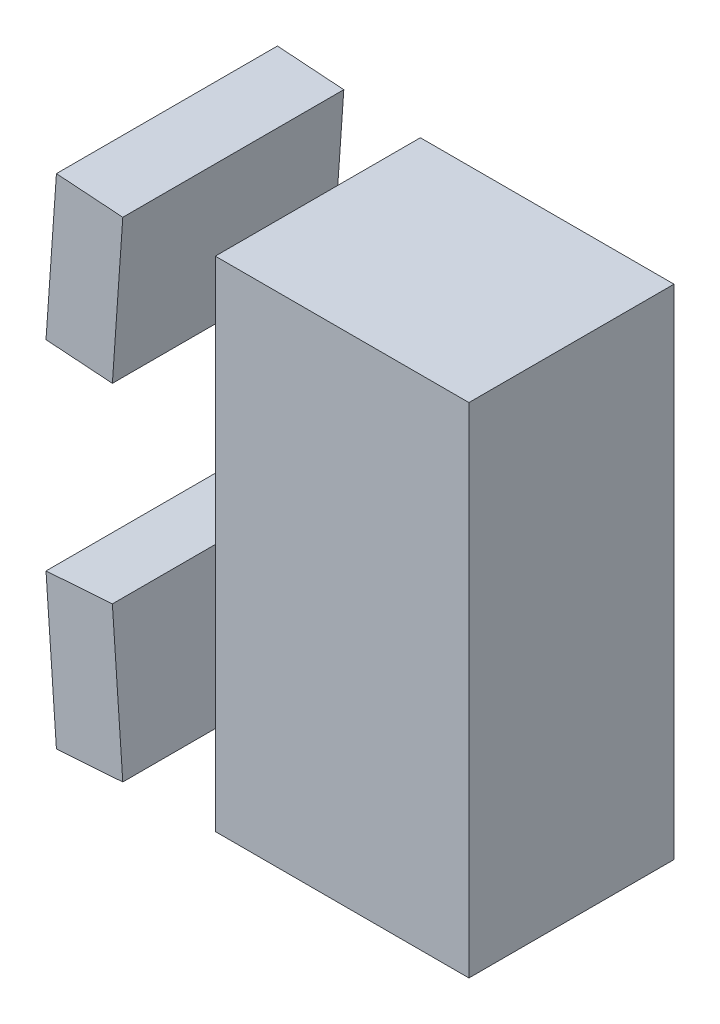
ISO-10303-21;
HEADER;
FILE_DESCRIPTION(('STEP AP214'),'2;1');
FILE_NAME('part.step','',(''),(''),'','','');
FILE_SCHEMA(('AUTOMOTIVE_DESIGN { 1 0 10303 214 1 1 1 1 }'));
ENDSEC;
DATA;
#1=APPLICATION_CONTEXT('core data for automotive mechanical design processes');
#2=APPLICATION_PROTOCOL_DEFINITION('international standard','automotive_design',2000,#1);
#3=PRODUCT_CONTEXT('',#1,'mechanical');
#4=PRODUCT('Part','Part','',(#3));
#5=PRODUCT_RELATED_PRODUCT_CATEGORY('part','',(#4));
#6=PRODUCT_DEFINITION_FORMATION('','',#4);
#7=PRODUCT_DEFINITION_CONTEXT('part definition',#1,'design');
#8=PRODUCT_DEFINITION('design','',#6,#7);
#9=PRODUCT_DEFINITION_SHAPE('','',#8);
#10=(LENGTH_UNIT() NAMED_UNIT(*) SI_UNIT(.MILLI.,.METRE.));
#11=(NAMED_UNIT(*) PLANE_ANGLE_UNIT() SI_UNIT($,.RADIAN.));
#12=(NAMED_UNIT(*) SI_UNIT($,.STERADIAN.) SOLID_ANGLE_UNIT());
#13=UNCERTAINTY_MEASURE_WITH_UNIT(LENGTH_MEASURE(1.E-05),#10,'distance_accuracy_value','');
#14=(GEOMETRIC_REPRESENTATION_CONTEXT(3) GLOBAL_UNCERTAINTY_ASSIGNED_CONTEXT((#13)) GLOBAL_UNIT_ASSIGNED_CONTEXT((#10,
#11,#12)) REPRESENTATION_CONTEXT('',''));
#15=CARTESIAN_POINT('',(0.,0.,0.));
#16=DIRECTION('',(0.,0.,1.));
#17=DIRECTION('',(1.,0.,0.));
#18=AXIS2_PLACEMENT_3D('',#15,#16,#17);
#19=CARTESIAN_POINT('',(18.2186626156835,26.9694448109971,20.6230863634355));
#20=DIRECTION('',(1.,0.,0.));
#21=DIRECTION('',(0.,0.,-1.));
#22=AXIS2_PLACEMENT_3D('',#19,#20,#21);
#23=PLANE('',#22);
#24=DIRECTION('',(0.,-1.,0.));
#25=VECTOR('',#24,1.);
#26=CARTESIAN_POINT('',(18.2186626156835,26.9694448109971,-1.57308636343545));
#27=LINE('',#26,#25);
#28=CARTESIAN_POINT('',(18.2186626156835,26.9694448109971,-1.57308636343545));
#29=VERTEX_POINT('',#28);
#30=CARTESIAN_POINT('',(18.2186626156835,-26.9694448109971,-1.57308636343545));
#31=VERTEX_POINT('',#30);
#32=EDGE_CURVE('E104',#29,#31,#27,.T.);
#33=ORIENTED_EDGE('',*,*,#32,.T.);
#34=DIRECTION('',(0.,0.,1.));
#35=VECTOR('',#34,1.);
#36=CARTESIAN_POINT('',(18.2186626156835,-26.9694448109971,20.6230863634355));
#37=LINE('',#36,#35);
#38=CARTESIAN_POINT('',(18.2186626156835,-26.9694448109971,20.6230863634355));
#39=VERTEX_POINT('',#38);
#40=EDGE_CURVE('E99',#31,#39,#37,.T.);
#41=ORIENTED_EDGE('',*,*,#40,.T.);
#42=DIRECTION('',(0.,-1.,0.));
#43=VECTOR('',#42,1.);
#44=CARTESIAN_POINT('',(18.2186626156835,26.9694448109971,20.6230863634355));
#45=LINE('',#44,#43);
#46=CARTESIAN_POINT('',(18.2186626156835,26.9694448109971,20.6230863634355));
#47=VERTEX_POINT('',#46);
#48=EDGE_CURVE('E12',#47,#39,#45,.T.);
#49=ORIENTED_EDGE('',*,*,#48,.F.);
#50=DIRECTION('',(0.,0.,1.));
#51=VECTOR('',#50,1.);
#52=CARTESIAN_POINT('',(18.2186626156835,26.9694448109971,20.6230863634355));
#53=LINE('',#52,#51);
#54=EDGE_CURVE('E110',#29,#47,#53,.T.);
#55=ORIENTED_EDGE('',*,*,#54,.F.);
#56=EDGE_LOOP('',(#33,#41,#49,#55));
#57=FACE_BOUND('',#56,.T.);
#58=ADVANCED_FACE('F47',(#57),#23,.F.);
#59=CARTESIAN_POINT('',(45.6703456351018,26.9694448109971,20.6230863634355));
#60=DIRECTION('',(0.,0.,-1.));
#61=DIRECTION('',(-1.,0.,0.));
#62=AXIS2_PLACEMENT_3D('',#59,#60,#61);
#63=PLANE('',#62);
#64=ORIENTED_EDGE('',*,*,#48,.T.);
#65=DIRECTION('',(1.,0.,0.));
#66=VECTOR('',#65,1.);
#67=CARTESIAN_POINT('',(45.6703456351018,-26.9694448109971,20.6230863634355));
#68=LINE('',#67,#66);
#69=CARTESIAN_POINT('',(45.6703456351018,-26.9694448109971,20.6230863634355));
#70=VERTEX_POINT('',#69);
#71=EDGE_CURVE('E89',#39,#70,#68,.T.);
#72=ORIENTED_EDGE('',*,*,#71,.T.);
#73=DIRECTION('',(0.,-1.,0.));
#74=VECTOR('',#73,1.);
#75=CARTESIAN_POINT('',(45.6703456351018,26.9694448109971,20.6230863634355));
#76=LINE('',#75,#74);
#77=CARTESIAN_POINT('',(45.6703456351018,26.9694448109971,20.6230863634355));
#78=VERTEX_POINT('',#77);
#79=EDGE_CURVE('E54',#78,#70,#76,.T.);
#80=ORIENTED_EDGE('',*,*,#79,.F.);
#81=DIRECTION('',(1.,0.,0.));
#82=VECTOR('',#81,1.);
#83=CARTESIAN_POINT('',(45.6703456351018,26.9694448109971,20.6230863634355));
#84=LINE('',#83,#82);
#85=EDGE_CURVE('E90',#47,#78,#84,.T.);
#86=ORIENTED_EDGE('',*,*,#85,.F.);
#87=EDGE_LOOP('',(#64,#72,#80,#86));
#88=FACE_BOUND('',#87,.T.);
#89=ADVANCED_FACE('F87',(#88),#63,.F.);
#90=CARTESIAN_POINT('',(45.6703456351018,26.9694448109971,20.6230863634355));
#91=DIRECTION('',(-1.,0.,0.));
#92=DIRECTION('',(0.,0.,1.));
#93=AXIS2_PLACEMENT_3D('',#90,#91,#92);
#94=PLANE('',#93);
#95=ORIENTED_EDGE('',*,*,#79,.T.);
#96=DIRECTION('',(0.,0.,-1.));
#97=VECTOR('',#96,1.);
#98=CARTESIAN_POINT('',(45.6703456351018,-26.9694448109971,20.6230863634355));
#99=LINE('',#98,#97);
#100=CARTESIAN_POINT('',(45.6703456351018,-26.9694448109971,-1.57308636343545));
#101=VERTEX_POINT('',#100);
#102=EDGE_CURVE('E102',#70,#101,#99,.T.);
#103=ORIENTED_EDGE('',*,*,#102,.T.);
#104=DIRECTION('',(0.,-1.,0.));
#105=VECTOR('',#104,1.);
#106=CARTESIAN_POINT('',(45.6703456351018,26.9694448109971,-1.57308636343545));
#107=LINE('',#106,#105);
#108=CARTESIAN_POINT('',(45.6703456351018,26.9694448109971,-1.57308636343545));
#109=VERTEX_POINT('',#108);
#110=EDGE_CURVE('E116',#109,#101,#107,.T.);
#111=ORIENTED_EDGE('',*,*,#110,.F.);
#112=DIRECTION('',(0.,0.,-1.));
#113=VECTOR('',#112,1.);
#114=CARTESIAN_POINT('',(45.6703456351018,26.9694448109971,20.6230863634355));
#115=LINE('',#114,#113);
#116=EDGE_CURVE('E66',#78,#109,#115,.T.);
#117=ORIENTED_EDGE('',*,*,#116,.F.);
#118=EDGE_LOOP('',(#95,#103,#111,#117));
#119=FACE_BOUND('',#118,.T.);
#120=ADVANCED_FACE('F118',(#119),#94,.F.);
#121=CARTESIAN_POINT('',(45.6703456351018,26.9694448109971,-1.57308636343545));
#122=DIRECTION('',(0.,0.,1.));
#123=DIRECTION('',(1.,0.,0.));
#124=AXIS2_PLACEMENT_3D('',#121,#122,#123);
#125=PLANE('',#124);
#126=ORIENTED_EDGE('',*,*,#110,.T.);
#127=DIRECTION('',(-1.,0.,0.));
#128=VECTOR('',#127,1.);
#129=CARTESIAN_POINT('',(45.6703456351018,-26.9694448109971,-1.57308636343545));
#130=LINE('',#129,#128);
#131=EDGE_CURVE('E108',#101,#31,#130,.T.);
#132=ORIENTED_EDGE('',*,*,#131,.T.);
#133=ORIENTED_EDGE('',*,*,#32,.F.);
#134=DIRECTION('',(-1.,0.,0.));
#135=VECTOR('',#134,1.);
#136=CARTESIAN_POINT('',(45.6703456351018,26.9694448109971,-1.57308636343545));
#137=LINE('',#136,#135);
#138=EDGE_CURVE('E61',#109,#29,#137,.T.);
#139=ORIENTED_EDGE('',*,*,#138,.F.);
#140=EDGE_LOOP('',(#126,#132,#133,#139));
#141=FACE_BOUND('',#140,.T.);
#142=ADVANCED_FACE('F120',(#141),#125,.F.);
#143=CARTESIAN_POINT('',(0.,26.9694448109971,0.));
#144=DIRECTION('',(0.,1.,0.));
#145=DIRECTION('',(0.,0.,1.));
#146=AXIS2_PLACEMENT_3D('',#143,#144,#145);
#147=PLANE('',#146);
#148=ORIENTED_EDGE('',*,*,#54,.T.);
#149=ORIENTED_EDGE('',*,*,#85,.T.);
#150=ORIENTED_EDGE('',*,*,#116,.T.);
#151=ORIENTED_EDGE('',*,*,#138,.T.);
#152=EDGE_LOOP('',(#148,#149,#150,#151));
#153=FACE_BOUND('',#152,.T.);
#154=ADVANCED_FACE('F121',(#153),#147,.T.);
#155=CARTESIAN_POINT('',(0.,-26.9694448109971,0.));
#156=DIRECTION('',(0.,1.,0.));
#157=DIRECTION('',(0.,0.,1.));
#158=AXIS2_PLACEMENT_3D('',#155,#156,#157);
#159=PLANE('',#158);
#160=ORIENTED_EDGE('',*,*,#40,.F.);
#161=ORIENTED_EDGE('',*,*,#131,.F.);
#162=ORIENTED_EDGE('',*,*,#102,.F.);
#163=ORIENTED_EDGE('',*,*,#71,.F.);
#164=EDGE_LOOP('',(#160,#161,#162,#163));
#165=FACE_BOUND('',#164,.T.);
#166=ADVANCED_FACE('F97',(#165),#159,.F.);
#167=CLOSED_SHELL('',(#58,#89,#120,#142,#154,#166));
#168=MANIFOLD_SOLID_BREP('B2',#167);
#169=CARTESIAN_POINT('',(38.6714902272278,24.3971448725628,21.4858197897311));
#170=DIRECTION('',(0.,0.,1.));
#171=DIRECTION('',(1.,0.,0.));
#172=AXIS2_PLACEMENT_3D('',#169,#170,#171);
#173=PLANE('',#172);
#174=DIRECTION('',(0.0697564737441286,0.997564050259824,0.));
#175=VECTOR('',#174,1.);
#176=CARTESIAN_POINT('',(9.06914650863051,26.4671423948604,21.4858197897311));
#177=LINE('',#176,#175);
#178=CARTESIAN_POINT('',(7.94111855150528,10.3355910517726,21.4858197897311));
#179=VERTEX_POINT('',#178);
#180=CARTESIAN_POINT('',(9.06914650863051,26.4671423948604,21.4858197897311));
#181=VERTEX_POINT('',#180);
#182=EDGE_CURVE('E187',#179,#181,#177,.T.);
#183=ORIENTED_EDGE('',*,*,#182,.T.);
#184=DIRECTION('',(-0.997564050259824,0.0697564737441285,0.));
#185=VECTOR('',#184,1.);
#186=CARTESIAN_POINT('',(38.6714902272278,24.3971448725628,21.4858197897311));
#187=LINE('',#186,#185);
#188=CARTESIAN_POINT('',(1.88588729551957,26.9694448109971,21.4858197897311));
#189=VERTEX_POINT('',#188);
#190=EDGE_CURVE('E235',#181,#189,#187,.T.);
#191=ORIENTED_EDGE('',*,*,#190,.T.);
#192=DIRECTION('',(-0.0697564737441285,-0.997564050259824,0.));
#193=VECTOR('',#192,1.);
#194=CARTESIAN_POINT('',(1.88588729551957,26.9694448109971,21.4858197897311));
#195=LINE('',#194,#193);
#196=CARTESIAN_POINT('',(0.757859338394332,10.8378934679094,21.4858197897311));
#197=VERTEX_POINT('',#196);
#198=EDGE_CURVE('E219',#189,#197,#195,.T.);
#199=ORIENTED_EDGE('',*,*,#198,.T.);
#200=DIRECTION('',(-0.997564050259824,0.0697564737441285,0.));
#201=VECTOR('',#200,1.);
#202=CARTESIAN_POINT('',(37.5434622701026,8.26559352947502,21.4858197897311));
#203=LINE('',#202,#201);
#204=EDGE_CURVE('E227',#179,#197,#203,.T.);
#205=ORIENTED_EDGE('',*,*,#204,.F.);
#206=EDGE_LOOP('',(#183,#191,#199,#205));
#207=FACE_BOUND('',#206,.T.);
#208=ADVANCED_FACE('F179',(#207),#173,.T.);
#209=CARTESIAN_POINT('',(38.6714902272278,24.3971448725628,-2.43581978973106));
#210=DIRECTION('',(0.0697564737441285,0.997564050259824,0.));
#211=DIRECTION('',(0.997564050259824,-0.0697564737441285,0.));
#212=AXIS2_PLACEMENT_3D('',#209,#210,#211);
#213=PLANE('',#212);
#214=DIRECTION('',(0.,0.,-1.));
#215=VECTOR('',#214,1.);
#216=CARTESIAN_POINT('',(9.06914650863051,26.4671423948604,-2.43581978973106));
#217=LINE('',#216,#215);
#218=CARTESIAN_POINT('',(9.06914650863052,26.4671423948604,-2.43581978973106));
#219=VERTEX_POINT('',#218);
#220=EDGE_CURVE('E249',#181,#219,#217,.T.);
#221=ORIENTED_EDGE('',*,*,#220,.T.);
#222=DIRECTION('',(-0.997564050259824,0.0697564737441285,0.));
#223=VECTOR('',#222,1.);
#224=CARTESIAN_POINT('',(38.6714902272278,24.3971448725628,-2.43581978973106));
#225=LINE('',#224,#223);
#226=CARTESIAN_POINT('',(1.88588729551957,26.9694448109971,-2.43581978973106));
#227=VERTEX_POINT('',#226);
#228=EDGE_CURVE('E243',#219,#227,#225,.T.);
#229=ORIENTED_EDGE('',*,*,#228,.T.);
#230=DIRECTION('',(0.,0.,1.));
#231=VECTOR('',#230,1.);
#232=CARTESIAN_POINT('',(1.88588729551957,26.9694448109971,-2.43581978973106));
#233=LINE('',#232,#231);
#234=EDGE_CURVE('E233',#227,#189,#233,.T.);
#235=ORIENTED_EDGE('',*,*,#234,.T.);
#236=ORIENTED_EDGE('',*,*,#190,.F.);
#237=EDGE_LOOP('',(#221,#229,#235,#236));
#238=FACE_BOUND('',#237,.T.);
#239=ADVANCED_FACE('F253',(#238),#213,.T.);
#240=CARTESIAN_POINT('',(38.6714902272278,24.3971448725628,-2.43581978973106));
#241=DIRECTION('',(0.,0.,-1.));
#242=DIRECTION('',(-1.,0.,0.));
#243=AXIS2_PLACEMENT_3D('',#240,#241,#242);
#244=PLANE('',#243);
#245=DIRECTION('',(-0.0697564737441286,-0.997564050259824,0.));
#246=VECTOR('',#245,1.);
#247=CARTESIAN_POINT('',(9.06914650863051,26.4671423948604,-2.43581978973106));
#248=LINE('',#247,#246);
#249=CARTESIAN_POINT('',(7.94111855150527,10.3355910517726,-2.43581978973106));
#250=VERTEX_POINT('',#249);
#251=EDGE_CURVE('E193',#219,#250,#248,.T.);
#252=ORIENTED_EDGE('',*,*,#251,.T.);
#253=DIRECTION('',(-0.997564050259824,0.0697564737441285,0.));
#254=VECTOR('',#253,1.);
#255=CARTESIAN_POINT('',(37.5434622701026,8.26559352947502,-2.43581978973106));
#256=LINE('',#255,#254);
#257=CARTESIAN_POINT('',(0.757859338394332,10.8378934679094,-2.43581978973106));
#258=VERTEX_POINT('',#257);
#259=EDGE_CURVE('E232',#250,#258,#256,.T.);
#260=ORIENTED_EDGE('',*,*,#259,.T.);
#261=DIRECTION('',(0.0697564737441285,0.997564050259824,0.));
#262=VECTOR('',#261,1.);
#263=CARTESIAN_POINT('',(1.88588729551957,26.9694448109971,-2.43581978973106));
#264=LINE('',#263,#262);
#265=EDGE_CURVE('E221',#258,#227,#264,.T.);
#266=ORIENTED_EDGE('',*,*,#265,.T.);
#267=ORIENTED_EDGE('',*,*,#228,.F.);
#268=EDGE_LOOP('',(#252,#260,#266,#267));
#269=FACE_BOUND('',#268,.T.);
#270=ADVANCED_FACE('F247',(#269),#244,.T.);
#271=CARTESIAN_POINT('',(37.5434622701026,8.26559352947502,-2.43581978973106));
#272=DIRECTION('',(-0.0697564737441285,-0.997564050259824,0.));
#273=DIRECTION('',(-0.997564050259824,0.0697564737441285,0.));
#274=AXIS2_PLACEMENT_3D('',#271,#272,#273);
#275=PLANE('',#274);
#276=DIRECTION('',(0.,0.,1.));
#277=VECTOR('',#276,1.);
#278=CARTESIAN_POINT('',(7.94111855150528,10.3355910517726,-2.43581978973106));
#279=LINE('',#278,#277);
#280=EDGE_CURVE('E45',#250,#179,#279,.T.);
#281=ORIENTED_EDGE('',*,*,#280,.T.);
#282=ORIENTED_EDGE('',*,*,#204,.T.);
#283=DIRECTION('',(0.,0.,-1.));
#284=VECTOR('',#283,1.);
#285=CARTESIAN_POINT('',(0.757859338394332,10.8378934679094,-2.43581978973106));
#286=LINE('',#285,#284);
#287=EDGE_CURVE('E214',#197,#258,#286,.T.);
#288=ORIENTED_EDGE('',*,*,#287,.T.);
#289=ORIENTED_EDGE('',*,*,#259,.F.);
#290=EDGE_LOOP('',(#281,#282,#288,#289));
#291=FACE_BOUND('',#290,.T.);
#292=ADVANCED_FACE('F228',(#291),#275,.T.);
#293=CARTESIAN_POINT('',(0.,0.,0.));
#294=DIRECTION('',(0.997564050259824,-0.0697564737441285,0.));
#295=DIRECTION('',(-0.0697564737441285,-0.997564050259824,0.));
#296=AXIS2_PLACEMENT_3D('',#293,#294,#295);
#297=PLANE('',#296);
#298=ORIENTED_EDGE('',*,*,#198,.F.);
#299=ORIENTED_EDGE('',*,*,#234,.F.);
#300=ORIENTED_EDGE('',*,*,#265,.F.);
#301=ORIENTED_EDGE('',*,*,#287,.F.);
#302=EDGE_LOOP('',(#298,#299,#300,#301));
#303=FACE_BOUND('',#302,.T.);
#304=ADVANCED_FACE('F216',(#303),#297,.F.);
#305=CARTESIAN_POINT('',(8.50513253006789,18.4013667233165,12.0777));
#306=DIRECTION('',(-0.997564050259824,0.0697564737441286,0.));
#307=DIRECTION('',(0.0697564737441286,0.997564050259824,0.));
#308=AXIS2_PLACEMENT_3D('',#305,#306,#307);
#309=PLANE('',#308);
#310=ORIENTED_EDGE('',*,*,#182,.F.);
#311=ORIENTED_EDGE('',*,*,#280,.F.);
#312=ORIENTED_EDGE('',*,*,#251,.F.);
#313=ORIENTED_EDGE('',*,*,#220,.F.);
#314=EDGE_LOOP('',(#310,#311,#312,#313));
#315=FACE_BOUND('',#314,.T.);
#316=ADVANCED_FACE('F252',(#315),#309,.F.);
#317=CLOSED_SHELL('',(#208,#239,#270,#292,#304,#316));
#318=MANIFOLD_SOLID_BREP('B6',#317);
#319=CARTESIAN_POINT('',(38.6714902272278,-24.3971448725628,21.4858197897311));
#320=DIRECTION('',(0.,0.,1.));
#321=DIRECTION('',(1.,0.,0.));
#322=AXIS2_PLACEMENT_3D('',#319,#320,#321);
#323=PLANE('',#322);
#324=DIRECTION('',(0.0697564737441286,-0.997564050259824,0.));
#325=VECTOR('',#324,1.);
#326=CARTESIAN_POINT('',(9.06914650863051,-26.4671423948604,21.4858197897311));
#327=LINE('',#326,#325);
#328=CARTESIAN_POINT('',(7.94111855150528,-10.3355910517726,21.4858197897311));
#329=VERTEX_POINT('',#328);
#330=CARTESIAN_POINT('',(9.06914650863051,-26.4671423948604,21.4858197897311));
#331=VERTEX_POINT('',#330);
#332=EDGE_CURVE('E333',#329,#331,#327,.T.);
#333=ORIENTED_EDGE('',*,*,#332,.F.);
#334=DIRECTION('',(-0.997564050259824,-0.0697564737441285,0.));
#335=VECTOR('',#334,1.);
#336=CARTESIAN_POINT('',(37.5434622701026,-8.26559352947502,21.4858197897311));
#337=LINE('',#336,#335);
#338=CARTESIAN_POINT('',(0.757859338394332,-10.8378934679094,21.4858197897311));
#339=VERTEX_POINT('',#338);
#340=EDGE_CURVE('E361',#329,#339,#337,.T.);
#341=ORIENTED_EDGE('',*,*,#340,.T.);
#342=DIRECTION('',(-0.0697564737441285,0.997564050259824,0.));
#343=VECTOR('',#342,1.);
#344=CARTESIAN_POINT('',(1.88588729551957,-26.9694448109971,21.4858197897311));
#345=LINE('',#344,#343);
#346=CARTESIAN_POINT('',(1.88588729551957,-26.9694448109971,21.4858197897311));
#347=VERTEX_POINT('',#346);
#348=EDGE_CURVE('E365',#347,#339,#345,.T.);
#349=ORIENTED_EDGE('',*,*,#348,.F.);
#350=DIRECTION('',(-0.997564050259824,-0.0697564737441285,0.));
#351=VECTOR('',#350,1.);
#352=CARTESIAN_POINT('',(38.6714902272278,-24.3971448725628,21.4858197897311));
#353=LINE('',#352,#351);
#354=EDGE_CURVE('E388',#331,#347,#353,.T.);
#355=ORIENTED_EDGE('',*,*,#354,.F.);
#356=EDGE_LOOP('',(#333,#341,#349,#355));
#357=FACE_BOUND('',#356,.T.);
#358=ADVANCED_FACE('F325',(#357),#323,.T.);
#359=CARTESIAN_POINT('',(38.6714902272278,-24.3971448725628,-2.43581978973106));
#360=DIRECTION('',(0.0697564737441285,-0.997564050259824,0.));
#361=DIRECTION('',(0.997564050259824,0.0697564737441285,0.));
#362=AXIS2_PLACEMENT_3D('',#359,#360,#361);
#363=PLANE('',#362);
#364=DIRECTION('',(0.,0.,-1.));
#365=VECTOR('',#364,1.);
#366=CARTESIAN_POINT('',(9.06914650863051,-26.4671423948604,-2.43581978973106));
#367=LINE('',#366,#365);
#368=CARTESIAN_POINT('',(9.06914650863052,-26.4671423948604,-2.43581978973106));
#369=VERTEX_POINT('',#368);
#370=EDGE_CURVE('E339',#331,#369,#367,.T.);
#371=ORIENTED_EDGE('',*,*,#370,.F.);
#372=ORIENTED_EDGE('',*,*,#354,.T.);
#373=DIRECTION('',(0.,0.,1.));
#374=VECTOR('',#373,1.);
#375=CARTESIAN_POINT('',(1.88588729551957,-26.9694448109971,-2.43581978973106));
#376=LINE('',#375,#374);
#377=CARTESIAN_POINT('',(1.88588729551957,-26.9694448109971,-2.43581978973106));
#378=VERTEX_POINT('',#377);
#379=EDGE_CURVE('E370',#378,#347,#376,.T.);
#380=ORIENTED_EDGE('',*,*,#379,.F.);
#381=DIRECTION('',(-0.997564050259824,-0.0697564737441285,0.));
#382=VECTOR('',#381,1.);
#383=CARTESIAN_POINT('',(38.6714902272278,-24.3971448725628,-2.43581978973106));
#384=LINE('',#383,#382);
#385=EDGE_CURVE('E391',#369,#378,#384,.T.);
#386=ORIENTED_EDGE('',*,*,#385,.F.);
#387=EDGE_LOOP('',(#371,#372,#380,#386));
#388=FACE_BOUND('',#387,.T.);
#389=ADVANCED_FACE('F397',(#388),#363,.T.);
#390=CARTESIAN_POINT('',(38.6714902272278,-24.3971448725628,-2.43581978973106));
#391=DIRECTION('',(0.,0.,-1.));
#392=DIRECTION('',(-1.,0.,0.));
#393=AXIS2_PLACEMENT_3D('',#390,#391,#392);
#394=PLANE('',#393);
#395=DIRECTION('',(-0.0697564737441286,0.997564050259824,0.));
#396=VECTOR('',#395,1.);
#397=CARTESIAN_POINT('',(9.06914650863051,-26.4671423948604,-2.43581978973106));
#398=LINE('',#397,#396);
#399=CARTESIAN_POINT('',(7.94111855150527,-10.3355910517726,-2.43581978973106));
#400=VERTEX_POINT('',#399);
#401=EDGE_CURVE('E390',#369,#400,#398,.T.);
#402=ORIENTED_EDGE('',*,*,#401,.F.);
#403=ORIENTED_EDGE('',*,*,#385,.T.);
#404=DIRECTION('',(0.0697564737441285,-0.997564050259824,0.));
#405=VECTOR('',#404,1.);
#406=CARTESIAN_POINT('',(1.88588729551957,-26.9694448109971,-2.43581978973106));
#407=LINE('',#406,#405);
#408=CARTESIAN_POINT('',(0.757859338394332,-10.8378934679094,-2.43581978973106));
#409=VERTEX_POINT('',#408);
#410=EDGE_CURVE('E378',#409,#378,#407,.T.);
#411=ORIENTED_EDGE('',*,*,#410,.F.);
#412=DIRECTION('',(-0.997564050259824,-0.0697564737441285,0.));
#413=VECTOR('',#412,1.);
#414=CARTESIAN_POINT('',(37.5434622701026,-8.26559352947502,-2.43581978973106));
#415=LINE('',#414,#413);
#416=EDGE_CURVE('E369',#400,#409,#415,.T.);
#417=ORIENTED_EDGE('',*,*,#416,.F.);
#418=EDGE_LOOP('',(#402,#403,#411,#417));
#419=FACE_BOUND('',#418,.T.);
#420=ADVANCED_FACE('F395',(#419),#394,.T.);
#421=CARTESIAN_POINT('',(37.5434622701026,-8.26559352947502,-2.43581978973106));
#422=DIRECTION('',(-0.0697564737441285,0.997564050259824,0.));
#423=DIRECTION('',(-0.997564050259824,-0.0697564737441285,0.));
#424=AXIS2_PLACEMENT_3D('',#421,#422,#423);
#425=PLANE('',#424);
#426=DIRECTION('',(0.,0.,1.));
#427=VECTOR('',#426,1.);
#428=CARTESIAN_POINT('',(7.94111855150528,-10.3355910517726,-2.43581978973106));
#429=LINE('',#428,#427);
#430=EDGE_CURVE('E177',#400,#329,#429,.T.);
#431=ORIENTED_EDGE('',*,*,#430,.F.);
#432=ORIENTED_EDGE('',*,*,#416,.T.);
#433=DIRECTION('',(0.,0.,-1.));
#434=VECTOR('',#433,1.);
#435=CARTESIAN_POINT('',(0.757859338394332,-10.8378934679094,-2.43581978973106));
#436=LINE('',#435,#434);
#437=EDGE_CURVE('E372',#339,#409,#436,.T.);
#438=ORIENTED_EDGE('',*,*,#437,.F.);
#439=ORIENTED_EDGE('',*,*,#340,.F.);
#440=EDGE_LOOP('',(#431,#432,#438,#439));
#441=FACE_BOUND('',#440,.T.);
#442=ADVANCED_FACE('F373',(#441),#425,.T.);
#443=CARTESIAN_POINT('',(0.,0.,0.));
#444=DIRECTION('',(0.997564050259824,0.0697564737441285,0.));
#445=DIRECTION('',(-0.0697564737441285,0.997564050259824,0.));
#446=AXIS2_PLACEMENT_3D('',#443,#444,#445);
#447=PLANE('',#446);
#448=ORIENTED_EDGE('',*,*,#348,.T.);
#449=ORIENTED_EDGE('',*,*,#437,.T.);
#450=ORIENTED_EDGE('',*,*,#410,.T.);
#451=ORIENTED_EDGE('',*,*,#379,.T.);
#452=EDGE_LOOP('',(#448,#449,#450,#451));
#453=FACE_BOUND('',#452,.T.);
#454=ADVANCED_FACE('F380',(#453),#447,.F.);
#455=CARTESIAN_POINT('',(8.50513253006789,-18.4013667233165,12.0777));
#456=DIRECTION('',(-0.997564050259824,-0.0697564737441286,0.));
#457=DIRECTION('',(0.0697564737441286,-0.997564050259824,0.));
#458=AXIS2_PLACEMENT_3D('',#455,#456,#457);
#459=PLANE('',#458);
#460=ORIENTED_EDGE('',*,*,#332,.T.);
#461=ORIENTED_EDGE('',*,*,#370,.T.);
#462=ORIENTED_EDGE('',*,*,#401,.T.);
#463=ORIENTED_EDGE('',*,*,#430,.T.);
#464=EDGE_LOOP('',(#460,#461,#462,#463));
#465=FACE_BOUND('',#464,.T.);
#466=ADVANCED_FACE('F399',(#465),#459,.F.);
#467=CLOSED_SHELL('',(#358,#389,#420,#442,#454,#466));
#468=MANIFOLD_SOLID_BREP('B39',#467);
#469=ADVANCED_BREP_SHAPE_REPRESENTATION('',(#18,#168,#318,#468),#14);
#470=SHAPE_DEFINITION_REPRESENTATION(#9,#469);
ENDSEC;
END-ISO-10303-21;
